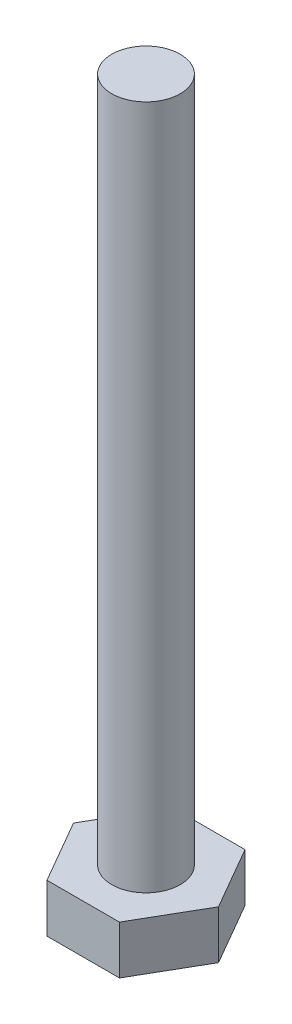
ISO-10303-21;
HEADER;
FILE_DESCRIPTION(('STEP AP214'),'2;1');
FILE_NAME('part.step','',(''),(''),'','','');
FILE_SCHEMA(('AUTOMOTIVE_DESIGN { 1 0 10303 214 1 1 1 1 }'));
ENDSEC;
DATA;
#1=APPLICATION_CONTEXT('core data for automotive mechanical design processes');
#2=APPLICATION_PROTOCOL_DEFINITION('international standard','automotive_design',2000,#1);
#3=PRODUCT_CONTEXT('',#1,'mechanical');
#4=PRODUCT('Part','Part','',(#3));
#5=PRODUCT_RELATED_PRODUCT_CATEGORY('part','',(#4));
#6=PRODUCT_DEFINITION_FORMATION('','',#4);
#7=PRODUCT_DEFINITION_CONTEXT('part definition',#1,'design');
#8=PRODUCT_DEFINITION('design','',#6,#7);
#9=PRODUCT_DEFINITION_SHAPE('','',#8);
#10=(LENGTH_UNIT() NAMED_UNIT(*) SI_UNIT(.MILLI.,.METRE.));
#11=(NAMED_UNIT(*) PLANE_ANGLE_UNIT() SI_UNIT($,.RADIAN.));
#12=(NAMED_UNIT(*) SI_UNIT($,.STERADIAN.) SOLID_ANGLE_UNIT());
#13=UNCERTAINTY_MEASURE_WITH_UNIT(LENGTH_MEASURE(1.E-05),#10,'distance_accuracy_value','');
#14=(GEOMETRIC_REPRESENTATION_CONTEXT(3) GLOBAL_UNCERTAINTY_ASSIGNED_CONTEXT((#13)) GLOBAL_UNIT_ASSIGNED_CONTEXT((#10,
#11,#12)) REPRESENTATION_CONTEXT('',''));
#15=CARTESIAN_POINT('',(0.,0.,0.));
#16=DIRECTION('',(0.,0.,1.));
#17=DIRECTION('',(1.,0.,0.));
#18=AXIS2_PLACEMENT_3D('',#15,#16,#17);
#19=CARTESIAN_POINT('',(0.,30.,0.));
#20=DIRECTION('',(0.,-1.,0.));
#21=DIRECTION('',(0.,0.,-1.));
#22=AXIS2_PLACEMENT_3D('',#19,#20,#21);
#23=CYLINDRICAL_SURFACE('',#22,1.5);
#24=CARTESIAN_POINT('',(0.,30.,0.));
#25=DIRECTION('',(0.,1.,0.));
#26=DIRECTION('',(0.,0.,1.));
#27=AXIS2_PLACEMENT_3D('',#24,#25,#26);
#28=CIRCLE('',#27,1.5);
#29=CARTESIAN_POINT('',(0.,30.,1.5));
#30=VERTEX_POINT('',#29);
#31=EDGE_CURVE('E11',#30,#30,#28,.T.);
#32=ORIENTED_EDGE('',*,*,#31,.F.);
#33=EDGE_LOOP('',(#32));
#34=FACE_BOUND('',#33,.T.);
#35=CARTESIAN_POINT('',(0.,0.,0.));
#36=DIRECTION('',(0.,1.,0.));
#37=DIRECTION('',(0.,0.,1.));
#38=AXIS2_PLACEMENT_3D('',#35,#36,#37);
#39=CIRCLE('',#38,1.5);
#40=CARTESIAN_POINT('',(0.,0.,1.5));
#41=VERTEX_POINT('',#40);
#42=EDGE_CURVE('E37',#41,#41,#39,.T.);
#43=ORIENTED_EDGE('',*,*,#42,.T.);
#44=EDGE_LOOP('',(#43));
#45=FACE_BOUND('',#44,.T.);
#46=ADVANCED_FACE('F34',(#34,#45),#23,.T.);
#47=CARTESIAN_POINT('',(0.,30.,0.));
#48=DIRECTION('',(0.,1.,0.));
#49=DIRECTION('',(0.,0.,1.));
#50=AXIS2_PLACEMENT_3D('',#47,#48,#49);
#51=PLANE('',#50);
#52=ORIENTED_EDGE('',*,*,#31,.T.);
#53=EDGE_LOOP('',(#52));
#54=FACE_BOUND('',#53,.T.);
#55=ADVANCED_FACE('F161',(#54),#51,.T.);
#56=CARTESIAN_POINT('',(-3.17542648054294,-2.12,0.));
#57=DIRECTION('',(0.866025403784439,0.,0.5));
#58=DIRECTION('',(0.5,0.,-0.866025403784439));
#59=AXIS2_PLACEMENT_3D('',#56,#57,#58);
#60=PLANE('',#59);
#61=DIRECTION('',(0.5,0.,-0.866025403784439));
#62=VECTOR('',#61,1.);
#63=CARTESIAN_POINT('',(-3.17542648054294,0.,0.));
#64=LINE('',#63,#62);
#65=CARTESIAN_POINT('',(-3.17542648054294,0.,0.));
#66=VERTEX_POINT('',#65);
#67=CARTESIAN_POINT('',(-1.58771324027147,0.,-2.75));
#68=VERTEX_POINT('',#67);
#69=EDGE_CURVE('E119',#66,#68,#64,.T.);
#70=ORIENTED_EDGE('',*,*,#69,.T.);
#71=DIRECTION('',(0.,1.,0.));
#72=VECTOR('',#71,1.);
#73=CARTESIAN_POINT('',(-1.58771324027147,-2.12,-2.75));
#74=LINE('',#73,#72);
#75=CARTESIAN_POINT('',(-1.58771324027147,-2.12,-2.75));
#76=VERTEX_POINT('',#75);
#77=EDGE_CURVE('E136',#76,#68,#74,.T.);
#78=ORIENTED_EDGE('',*,*,#77,.F.);
#79=DIRECTION('',(0.5,0.,-0.866025403784439));
#80=VECTOR('',#79,1.);
#81=CARTESIAN_POINT('',(-3.17542648054294,-2.12,0.));
#82=LINE('',#81,#80);
#83=CARTESIAN_POINT('',(-3.17542648054294,-2.12,0.));
#84=VERTEX_POINT('',#83);
#85=EDGE_CURVE('E129',#84,#76,#82,.T.);
#86=ORIENTED_EDGE('',*,*,#85,.F.);
#87=DIRECTION('',(0.,1.,0.));
#88=VECTOR('',#87,1.);
#89=CARTESIAN_POINT('',(-3.17542648054294,-2.12,0.));
#90=LINE('',#89,#88);
#91=EDGE_CURVE('E115',#84,#66,#90,.T.);
#92=ORIENTED_EDGE('',*,*,#91,.T.);
#93=EDGE_LOOP('',(#70,#78,#86,#92));
#94=FACE_BOUND('',#93,.T.);
#95=ADVANCED_FACE('F149',(#94),#60,.F.);
#96=CARTESIAN_POINT('',(-1.58771324027147,-2.12,-2.75));
#97=DIRECTION('',(0.,0.,1.));
#98=DIRECTION('',(1.,0.,0.));
#99=AXIS2_PLACEMENT_3D('',#96,#97,#98);
#100=PLANE('',#99);
#101=DIRECTION('',(1.,0.,0.));
#102=VECTOR('',#101,1.);
#103=CARTESIAN_POINT('',(-1.58771324027147,0.,-2.75));
#104=LINE('',#103,#102);
#105=CARTESIAN_POINT('',(1.58771324027147,0.,-2.75));
#106=VERTEX_POINT('',#105);
#107=EDGE_CURVE('E122',#68,#106,#104,.T.);
#108=ORIENTED_EDGE('',*,*,#107,.T.);
#109=DIRECTION('',(0.,1.,0.));
#110=VECTOR('',#109,1.);
#111=CARTESIAN_POINT('',(1.58771324027147,-2.12,-2.75));
#112=LINE('',#111,#110);
#113=CARTESIAN_POINT('',(1.58771324027147,-2.12,-2.75));
#114=VERTEX_POINT('',#113);
#115=EDGE_CURVE('E133',#114,#106,#112,.T.);
#116=ORIENTED_EDGE('',*,*,#115,.F.);
#117=DIRECTION('',(1.,0.,0.));
#118=VECTOR('',#117,1.);
#119=CARTESIAN_POINT('',(-1.58771324027147,-2.12,-2.75));
#120=LINE('',#119,#118);
#121=EDGE_CURVE('E88',#76,#114,#120,.T.);
#122=ORIENTED_EDGE('',*,*,#121,.F.);
#123=ORIENTED_EDGE('',*,*,#77,.T.);
#124=EDGE_LOOP('',(#108,#116,#122,#123));
#125=FACE_BOUND('',#124,.T.);
#126=ADVANCED_FACE('F171',(#125),#100,.F.);
#127=CARTESIAN_POINT('',(1.58771324027147,-2.12,-2.75));
#128=DIRECTION('',(-0.866025403784439,0.,0.5));
#129=DIRECTION('',(0.5,0.,0.866025403784439));
#130=AXIS2_PLACEMENT_3D('',#127,#128,#129);
#131=PLANE('',#130);
#132=DIRECTION('',(0.5,0.,0.866025403784439));
#133=VECTOR('',#132,1.);
#134=CARTESIAN_POINT('',(1.58771324027147,0.,-2.75));
#135=LINE('',#134,#133);
#136=CARTESIAN_POINT('',(3.17542648054294,0.,0.));
#137=VERTEX_POINT('',#136);
#138=EDGE_CURVE('E124',#106,#137,#135,.T.);
#139=ORIENTED_EDGE('',*,*,#138,.T.);
#140=DIRECTION('',(0.,1.,0.));
#141=VECTOR('',#140,1.);
#142=CARTESIAN_POINT('',(3.17542648054294,-2.12,0.));
#143=LINE('',#142,#141);
#144=CARTESIAN_POINT('',(3.17542648054294,-2.12,0.));
#145=VERTEX_POINT('',#144);
#146=EDGE_CURVE('E110',#145,#137,#143,.T.);
#147=ORIENTED_EDGE('',*,*,#146,.F.);
#148=DIRECTION('',(0.5,0.,0.866025403784439));
#149=VECTOR('',#148,1.);
#150=CARTESIAN_POINT('',(1.58771324027147,-2.12,-2.75));
#151=LINE('',#150,#149);
#152=EDGE_CURVE('E101',#114,#145,#151,.T.);
#153=ORIENTED_EDGE('',*,*,#152,.F.);
#154=ORIENTED_EDGE('',*,*,#115,.T.);
#155=EDGE_LOOP('',(#139,#147,#153,#154));
#156=FACE_BOUND('',#155,.T.);
#157=ADVANCED_FACE('F176',(#156),#131,.F.);
#158=CARTESIAN_POINT('',(3.17542648054294,-2.12,0.));
#159=DIRECTION('',(-0.866025403784439,0.,-0.5));
#160=DIRECTION('',(-0.5,0.,0.866025403784439));
#161=AXIS2_PLACEMENT_3D('',#158,#159,#160);
#162=PLANE('',#161);
#163=DIRECTION('',(-0.5,0.,0.866025403784438));
#164=VECTOR('',#163,1.);
#165=CARTESIAN_POINT('',(3.17542648054294,0.,0.));
#166=LINE('',#165,#164);
#167=CARTESIAN_POINT('',(1.58771324027147,0.,2.75));
#168=VERTEX_POINT('',#167);
#169=EDGE_CURVE('E109',#137,#168,#166,.T.);
#170=ORIENTED_EDGE('',*,*,#169,.T.);
#171=DIRECTION('',(0.,1.,0.));
#172=VECTOR('',#171,1.);
#173=CARTESIAN_POINT('',(1.58771324027147,-2.12,2.75));
#174=LINE('',#173,#172);
#175=CARTESIAN_POINT('',(1.58771324027147,-2.12,2.75));
#176=VERTEX_POINT('',#175);
#177=EDGE_CURVE('E106',#176,#168,#174,.T.);
#178=ORIENTED_EDGE('',*,*,#177,.F.);
#179=DIRECTION('',(-0.5,0.,0.866025403784438));
#180=VECTOR('',#179,1.);
#181=CARTESIAN_POINT('',(3.17542648054294,-2.12,0.));
#182=LINE('',#181,#180);
#183=EDGE_CURVE('E95',#145,#176,#182,.T.);
#184=ORIENTED_EDGE('',*,*,#183,.F.);
#185=ORIENTED_EDGE('',*,*,#146,.T.);
#186=EDGE_LOOP('',(#170,#178,#184,#185));
#187=FACE_BOUND('',#186,.T.);
#188=ADVANCED_FACE('F107',(#187),#162,.F.);
#189=CARTESIAN_POINT('',(1.58771324027147,-2.12,2.75));
#190=DIRECTION('',(0.,0.,-1.));
#191=DIRECTION('',(-1.,0.,0.));
#192=AXIS2_PLACEMENT_3D('',#189,#190,#191);
#193=PLANE('',#192);
#194=DIRECTION('',(-1.,0.,0.));
#195=VECTOR('',#194,1.);
#196=CARTESIAN_POINT('',(1.58771324027147,0.,2.75));
#197=LINE('',#196,#195);
#198=CARTESIAN_POINT('',(-1.58771324027147,0.,2.75));
#199=VERTEX_POINT('',#198);
#200=EDGE_CURVE('E73',#168,#199,#197,.T.);
#201=ORIENTED_EDGE('',*,*,#200,.T.);
#202=DIRECTION('',(0.,1.,0.));
#203=VECTOR('',#202,1.);
#204=CARTESIAN_POINT('',(-1.58771324027147,-2.12,2.75));
#205=LINE('',#204,#203);
#206=CARTESIAN_POINT('',(-1.58771324027147,-2.12,2.75));
#207=VERTEX_POINT('',#206);
#208=EDGE_CURVE('E111',#207,#199,#205,.T.);
#209=ORIENTED_EDGE('',*,*,#208,.F.);
#210=DIRECTION('',(-1.,0.,0.));
#211=VECTOR('',#210,1.);
#212=CARTESIAN_POINT('',(1.58771324027147,-2.12,2.75));
#213=LINE('',#212,#211);
#214=EDGE_CURVE('E99',#176,#207,#213,.T.);
#215=ORIENTED_EDGE('',*,*,#214,.F.);
#216=ORIENTED_EDGE('',*,*,#177,.T.);
#217=EDGE_LOOP('',(#201,#209,#215,#216));
#218=FACE_BOUND('',#217,.T.);
#219=ADVANCED_FACE('F113',(#218),#193,.F.);
#220=CARTESIAN_POINT('',(-1.58771324027147,-2.12,2.75));
#221=DIRECTION('',(0.866025403784438,0.,-0.5));
#222=DIRECTION('',(-0.5,0.,-0.866025403784439));
#223=AXIS2_PLACEMENT_3D('',#220,#221,#222);
#224=PLANE('',#223);
#225=DIRECTION('',(-0.5,0.,-0.866025403784438));
#226=VECTOR('',#225,1.);
#227=CARTESIAN_POINT('',(-1.58771324027147,0.,2.75));
#228=LINE('',#227,#226);
#229=EDGE_CURVE('E79',#199,#66,#228,.T.);
#230=ORIENTED_EDGE('',*,*,#229,.T.);
#231=ORIENTED_EDGE('',*,*,#91,.F.);
#232=DIRECTION('',(-0.5,0.,-0.866025403784438));
#233=VECTOR('',#232,1.);
#234=CARTESIAN_POINT('',(-1.58771324027147,-2.12,2.75));
#235=LINE('',#234,#233);
#236=EDGE_CURVE('E50',#207,#84,#235,.T.);
#237=ORIENTED_EDGE('',*,*,#236,.F.);
#238=ORIENTED_EDGE('',*,*,#208,.T.);
#239=EDGE_LOOP('',(#230,#231,#237,#238));
#240=FACE_BOUND('',#239,.T.);
#241=ADVANCED_FACE('F151',(#240),#224,.F.);
#242=CARTESIAN_POINT('',(0.,-2.12,0.));
#243=DIRECTION('',(0.,-1.,0.));
#244=DIRECTION('',(0.,0.,-1.));
#245=AXIS2_PLACEMENT_3D('',#242,#243,#244);
#246=PLANE('',#245);
#247=ORIENTED_EDGE('',*,*,#85,.T.);
#248=ORIENTED_EDGE('',*,*,#121,.T.);
#249=ORIENTED_EDGE('',*,*,#152,.T.);
#250=ORIENTED_EDGE('',*,*,#183,.T.);
#251=ORIENTED_EDGE('',*,*,#214,.T.);
#252=ORIENTED_EDGE('',*,*,#236,.T.);
#253=EDGE_LOOP('',(#247,#248,#249,#250,#251,#252));
#254=FACE_BOUND('',#253,.T.);
#255=ADVANCED_FACE('F97',(#254),#246,.T.);
#256=CARTESIAN_POINT('',(0.,0.,0.));
#257=DIRECTION('',(0.,-1.,0.));
#258=DIRECTION('',(0.,0.,-1.));
#259=AXIS2_PLACEMENT_3D('',#256,#257,#258);
#260=PLANE('',#259);
#261=ORIENTED_EDGE('',*,*,#42,.F.);
#262=EDGE_LOOP('',(#261));
#263=FACE_BOUND('',#262,.T.);
#264=ORIENTED_EDGE('',*,*,#69,.F.);
#265=ORIENTED_EDGE('',*,*,#229,.F.);
#266=ORIENTED_EDGE('',*,*,#200,.F.);
#267=ORIENTED_EDGE('',*,*,#169,.F.);
#268=ORIENTED_EDGE('',*,*,#138,.F.);
#269=ORIENTED_EDGE('',*,*,#107,.F.);
#270=EDGE_LOOP('',(#264,#265,#266,#267,#268,#269));
#271=FACE_BOUND('',#270,.T.);
#272=ADVANCED_FACE('F142',(#263,#271),#260,.F.);
#273=CLOSED_SHELL('',(#46,#55,#95,#126,#157,#188,#219,#241,#255,#272));
#274=MANIFOLD_SOLID_BREP('B2',#273);
#275=ADVANCED_BREP_SHAPE_REPRESENTATION('',(#18,#274),#14);
#276=SHAPE_DEFINITION_REPRESENTATION(#9,#275);
ENDSEC;
END-ISO-10303-21;
